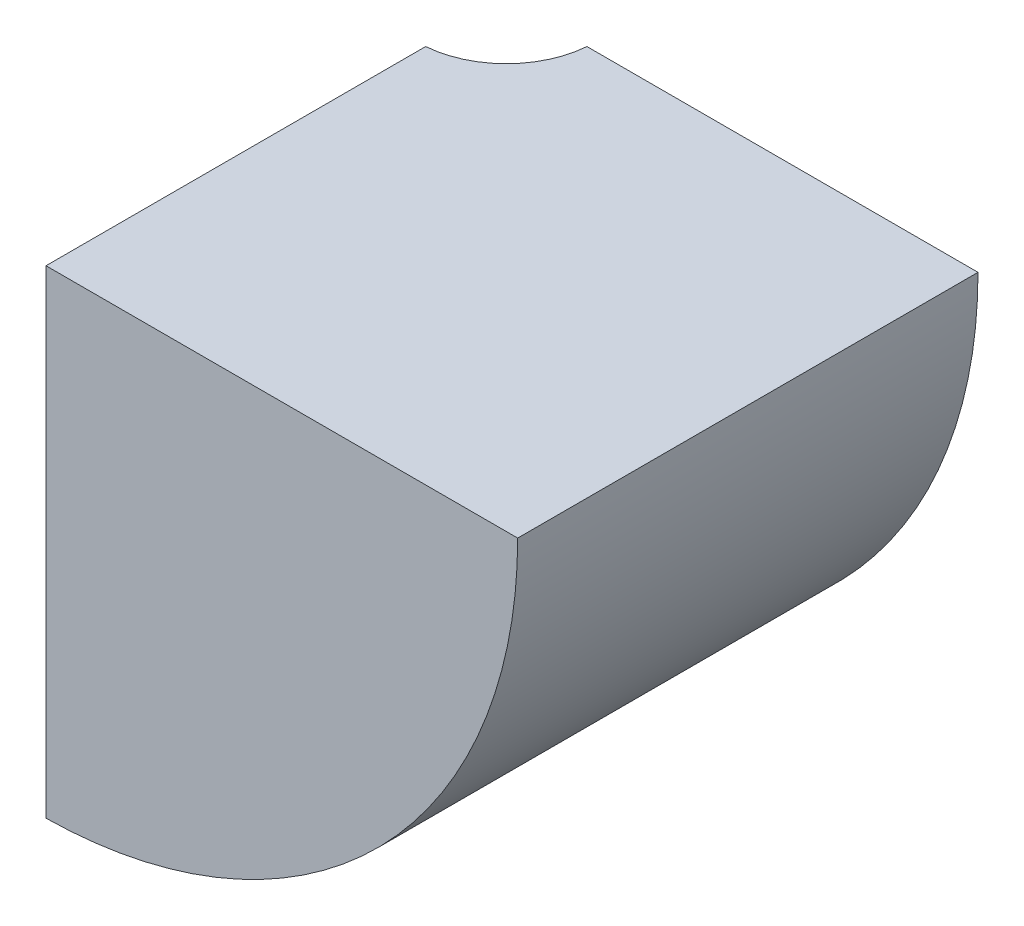
ISO-10303-21;
HEADER;
FILE_DESCRIPTION(('STEP AP214'),'2;1');
FILE_NAME('part.step','',(''),(''),'','','');
FILE_SCHEMA(('AUTOMOTIVE_DESIGN { 1 0 10303 214 1 1 1 1 }'));
ENDSEC;
DATA;
#1=APPLICATION_CONTEXT('core data for automotive mechanical design processes');
#2=APPLICATION_PROTOCOL_DEFINITION('international standard','automotive_design',2000,#1);
#3=PRODUCT_CONTEXT('',#1,'mechanical');
#4=PRODUCT('Part','Part','',(#3));
#5=PRODUCT_RELATED_PRODUCT_CATEGORY('part','',(#4));
#6=PRODUCT_DEFINITION_FORMATION('','',#4);
#7=PRODUCT_DEFINITION_CONTEXT('part definition',#1,'design');
#8=PRODUCT_DEFINITION('design','',#6,#7);
#9=PRODUCT_DEFINITION_SHAPE('','',#8);
#10=(LENGTH_UNIT() NAMED_UNIT(*) SI_UNIT(.MILLI.,.METRE.));
#11=(NAMED_UNIT(*) PLANE_ANGLE_UNIT() SI_UNIT($,.RADIAN.));
#12=(NAMED_UNIT(*) SI_UNIT($,.STERADIAN.) SOLID_ANGLE_UNIT());
#13=UNCERTAINTY_MEASURE_WITH_UNIT(LENGTH_MEASURE(1.E-05),#10,'distance_accuracy_value','');
#14=(GEOMETRIC_REPRESENTATION_CONTEXT(3) GLOBAL_UNCERTAINTY_ASSIGNED_CONTEXT((#13)) GLOBAL_UNIT_ASSIGNED_CONTEXT((#10,
#11,#12)) REPRESENTATION_CONTEXT('',''));
#15=CARTESIAN_POINT('',(0.,0.,0.));
#16=DIRECTION('',(0.,0.,1.));
#17=DIRECTION('',(1.,0.,0.));
#18=AXIS2_PLACEMENT_3D('',#15,#16,#17);
#19=CARTESIAN_POINT('',(0.,0.,41.));
#20=DIRECTION('',(0.,0.,-1.));
#21=DIRECTION('',(-1.,0.,0.));
#22=AXIS2_PLACEMENT_3D('',#19,#20,#21);
#23=CYLINDRICAL_SURFACE('',#22,42.);
#24=CARTESIAN_POINT('',(0.,0.,41.));
#25=DIRECTION('',(0.,0.,1.));
#26=DIRECTION('',(1.,0.,0.));
#27=AXIS2_PLACEMENT_3D('',#24,#25,#26);
#28=CIRCLE('',#27,42.);
#29=CARTESIAN_POINT('',(0.6,-41.9957140670331,41.));
#30=VERTEX_POINT('',#29);
#31=CARTESIAN_POINT('',(42.,0.,41.));
#32=VERTEX_POINT('',#31);
#33=EDGE_CURVE('E100',#30,#32,#28,.T.);
#34=ORIENTED_EDGE('',*,*,#33,.F.);
#35=DIRECTION('',(0.,0.,-1.));
#36=VECTOR('',#35,1.);
#37=CARTESIAN_POINT('',(0.6,-41.9957140670331,41.));
#38=LINE('',#37,#36);
#39=CARTESIAN_POINT('',(0.6,-41.9957140670331,7.6765877836445));
#40=VERTEX_POINT('',#39);
#41=EDGE_CURVE('E81',#30,#40,#38,.T.);
#42=ORIENTED_EDGE('',*,*,#41,.T.);
#43=CARTESIAN_POINT('',(0.,-42.,7.69999999999999));
#44=CARTESIAN_POINT('',(0.214661189812966,-42.0000163933078,7.70002522535463));
#45=CARTESIAN_POINT('',(0.429316458936862,-41.9983548762452,7.69102458371643));
#46=CARTESIAN_POINT('',(0.857056773200532,-41.9917948080387,7.65515552505157));
#47=CARTESIAN_POINT('',(1.07014198500119,-41.9868966056226,7.62828903292973));
#48=CARTESIAN_POINT('',(1.49292882316759,-41.9739911209351,7.55692311719224));
#49=CARTESIAN_POINT('',(1.70263484419704,-41.965988285519,7.5124489117479));
#50=CARTESIAN_POINT('',(2.1174887043463,-41.9471016115582,7.40621912778807));
#51=CARTESIAN_POINT('',(2.32263654143767,-41.9362177717316,7.34446354158237));
#52=CARTESIAN_POINT('',(2.72693909328696,-41.9118697789648,7.2041372814937));
#53=CARTESIAN_POINT('',(2.92609379229552,-41.8984056192444,7.12556656342662));
#54=CARTESIAN_POINT('',(3.31710988226874,-41.8692636087246,6.95216080587093));
#55=CARTESIAN_POINT('',(3.5089685532466,-41.853584942421,6.85731977197585));
#56=CARTESIAN_POINT('',(3.8839850808559,-41.820450675344,6.65209311551742));
#57=CARTESIAN_POINT('',(4.06714417652964,-41.802995328735,6.54170971551683));
#58=CARTESIAN_POINT('',(4.42356806732711,-41.7667827348401,6.30616192114487));
#59=CARTESIAN_POINT('',(4.59683252801584,-41.7480254435964,6.18099702760266));
#60=CARTESIAN_POINT('',(4.93400694104062,-41.709527252614,5.91541168212752));
#61=CARTESIAN_POINT('',(5.09780448389459,-41.6897783199113,5.77484966551783));
#62=CARTESIAN_POINT('',(5.41301119696934,-41.6500246179644,5.48049367544318));
#63=CARTESIAN_POINT('',(5.56442028794676,-41.6300198470847,5.32669961735172));
#64=CARTESIAN_POINT('',(5.85384815061183,-41.5903090754971,5.00689345896104));
#65=CARTESIAN_POINT('',(5.99186410635733,-41.5706031383515,4.84087880209617));
#66=CARTESIAN_POINT('',(6.25351302726115,-41.5320486777089,4.49779020667886));
#67=CARTESIAN_POINT('',(6.3771463316427,-41.5132001339963,4.32071652911134));
#68=CARTESIAN_POINT('',(6.61009361533324,-41.476748652319,3.95524876227588));
#69=CARTESIAN_POINT('',(6.71928498997473,-41.4591568985644,3.76677537082252));
#70=CARTESIAN_POINT('',(6.92133519733714,-41.4259049697142,3.38119503404902));
#71=CARTESIAN_POINT('',(7.0142000108884,-41.4102440879221,3.18409128343498));
#72=CARTESIAN_POINT('',(7.18291728741062,-41.3813126096725,2.78263817543174));
#73=CARTESIAN_POINT('',(7.25877609459446,-41.3680411221993,2.57829155310602));
#74=CARTESIAN_POINT('',(7.39291955762718,-41.3442784833262,2.16384029875247));
#75=CARTESIAN_POINT('',(7.45120850697619,-41.3337866527449,1.95373708715971));
#76=CARTESIAN_POINT('',(7.56669579487874,-41.3128279305321,1.45626018583863));
#77=CARTESIAN_POINT('',(7.61666221576772,-41.3036039817758,1.16710148292995));
#78=CARTESIAN_POINT('',(7.66664585316107,-41.2943431982756,0.730756565595945));
#79=CARTESIAN_POINT('',(7.67914605345211,-41.2920188085843,0.584928207318106));
#80=CARTESIAN_POINT('',(7.6958234407679,-41.2889130888019,0.292746587087686));
#81=CARTESIAN_POINT('',(7.69999872929735,-41.288132110686,0.146393213026887));
#82=CARTESIAN_POINT('',(7.7,-41.2881338885642,0.));
#83=B_SPLINE_CURVE_WITH_KNOTS('',3,(#43,#44,#45,#46,#47,#48,#49,#50,#51,#52,#53,#54,#55,#56,#57,
#58,#59,#60,#61,#62,#63,#64,#65,#66,#67,#68,#69,#70,#71,#72,#73,#74,#75,#76,#77,#78,#79,#80,#81,
#82),.UNSPECIFIED.,.F.,.F.,(4,2,2,2,2,2,2,2,2,2,2,2,2,2,2,2,2,2,2,4),(0.,0.643779697213744,
1.28749004346622,1.93028176892669,2.57307378042971,3.21586748097861,3.85889851400501,
4.5018376866233,5.14479857750093,5.79426608670598,6.44373774993785,7.09334567177995,
7.74293826913184,8.39773308887107,9.05228753870625,9.70659739443971,10.3607472283209,
11.2392736650466,11.678212268625,12.1172509606643),.UNSPECIFIED.);
#84=CARTESIAN_POINT('',(7.6765877836445,-41.2924932645148,0.600000000000001));
#85=VERTEX_POINT('',#84);
#86=EDGE_CURVE('E104',#40,#85,#83,.T.);
#87=ORIENTED_EDGE('',*,*,#86,.T.);
#88=CARTESIAN_POINT('',(0.,0.,0.599999999999996));
#89=DIRECTION('',(0.,0.,1.));
#90=DIRECTION('',(1.,0.,0.));
#91=AXIS2_PLACEMENT_3D('',#88,#89,#90);
#92=CIRCLE('',#91,42.);
#93=CARTESIAN_POINT('',(42.,0.,0.599999999999998));
#94=VERTEX_POINT('',#93);
#95=EDGE_CURVE('E62',#85,#94,#92,.T.);
#96=ORIENTED_EDGE('',*,*,#95,.T.);
#97=DIRECTION('',(0.,0.,1.));
#98=VECTOR('',#97,1.);
#99=CARTESIAN_POINT('',(42.,0.,0.));
#100=LINE('',#99,#98);
#101=EDGE_CURVE('E103',#94,#32,#100,.T.);
#102=ORIENTED_EDGE('',*,*,#101,.T.);
#103=EDGE_LOOP('',(#34,#42,#87,#96,#102));
#104=FACE_BOUND('',#103,.T.);
#105=ADVANCED_FACE('F39',(#104),#23,.T.);
#106=CARTESIAN_POINT('',(0.,0.,41.));
#107=DIRECTION('',(0.,0.,1.));
#108=DIRECTION('',(1.,0.,0.));
#109=AXIS2_PLACEMENT_3D('',#106,#107,#108);
#110=PLANE('',#109);
#111=DIRECTION('',(0.,1.,0.));
#112=VECTOR('',#111,1.);
#113=CARTESIAN_POINT('',(0.6,-42.,41.));
#114=LINE('',#113,#112);
#115=CARTESIAN_POINT('',(0.6,0.,41.));
#116=VERTEX_POINT('',#115);
#117=EDGE_CURVE('E78',#30,#116,#114,.T.);
#118=ORIENTED_EDGE('',*,*,#117,.F.);
#119=ORIENTED_EDGE('',*,*,#33,.T.);
#120=DIRECTION('',(1.,0.,0.));
#121=VECTOR('',#120,1.);
#122=CARTESIAN_POINT('',(0.,0.,41.));
#123=LINE('',#122,#121);
#124=EDGE_CURVE('E92',#116,#32,#123,.T.);
#125=ORIENTED_EDGE('',*,*,#124,.F.);
#126=EDGE_LOOP('',(#118,#119,#125));
#127=FACE_BOUND('',#126,.T.);
#128=ADVANCED_FACE('F99',(#127),#110,.T.);
#129=CARTESIAN_POINT('',(0.,0.,0.));
#130=DIRECTION('',(0.,-1.,0.));
#131=DIRECTION('',(0.,0.,-1.));
#132=AXIS2_PLACEMENT_3D('',#129,#130,#131);
#133=PLANE('',#132);
#134=CARTESIAN_POINT('',(0.,0.,0.));
#135=DIRECTION('',(0.,1.,0.));
#136=DIRECTION('',(0.,0.,1.));
#137=AXIS2_PLACEMENT_3D('',#134,#135,#136);
#138=CIRCLE('',#137,7.7);
#139=CARTESIAN_POINT('',(0.6,0.,7.6765877836445));
#140=VERTEX_POINT('',#139);
#141=CARTESIAN_POINT('',(7.6765877836445,0.,0.600000000000001));
#142=VERTEX_POINT('',#141);
#143=EDGE_CURVE('E95',#140,#142,#138,.T.);
#144=ORIENTED_EDGE('',*,*,#143,.F.);
#145=DIRECTION('',(0.,0.,-1.));
#146=VECTOR('',#145,1.);
#147=CARTESIAN_POINT('',(0.6,0.,41.));
#148=LINE('',#147,#146);
#149=EDGE_CURVE('E55',#116,#140,#148,.T.);
#150=ORIENTED_EDGE('',*,*,#149,.F.);
#151=ORIENTED_EDGE('',*,*,#124,.T.);
#152=ORIENTED_EDGE('',*,*,#101,.F.);
#153=DIRECTION('',(1.,0.,0.));
#154=VECTOR('',#153,1.);
#155=CARTESIAN_POINT('',(42.,0.,0.599999999999998));
#156=LINE('',#155,#154);
#157=EDGE_CURVE('E97',#142,#94,#156,.T.);
#158=ORIENTED_EDGE('',*,*,#157,.F.);
#159=EDGE_LOOP('',(#144,#150,#151,#152,#158));
#160=FACE_BOUND('',#159,.T.);
#161=ADVANCED_FACE('F90',(#160),#133,.F.);
#162=CARTESIAN_POINT('',(0.,-42.,0.));
#163=DIRECTION('',(0.,1.,0.));
#164=DIRECTION('',(0.,0.,1.));
#165=AXIS2_PLACEMENT_3D('',#162,#163,#164);
#166=CYLINDRICAL_SURFACE('',#165,7.7);
#167=ORIENTED_EDGE('',*,*,#86,.F.);
#168=DIRECTION('',(0.,1.,0.));
#169=VECTOR('',#168,1.);
#170=CARTESIAN_POINT('',(0.6,-42.,7.6765877836445));
#171=LINE('',#170,#169);
#172=EDGE_CURVE('E11',#40,#140,#171,.T.);
#173=ORIENTED_EDGE('',*,*,#172,.T.);
#174=ORIENTED_EDGE('',*,*,#143,.T.);
#175=DIRECTION('',(0.,1.,0.));
#176=VECTOR('',#175,1.);
#177=CARTESIAN_POINT('',(7.6765877836445,-42.,0.600000000000001));
#178=LINE('',#177,#176);
#179=EDGE_CURVE('E48',#142,#85,#178,.F.);
#180=ORIENTED_EDGE('',*,*,#179,.T.);
#181=EDGE_LOOP('',(#167,#173,#174,#180));
#182=FACE_BOUND('',#181,.T.);
#183=ADVANCED_FACE('F122',(#182),#166,.F.);
#184=CARTESIAN_POINT('',(42.,-42.,0.599999999999998));
#185=DIRECTION('',(0.,0.,1.));
#186=DIRECTION('',(1.,0.,0.));
#187=AXIS2_PLACEMENT_3D('',#184,#185,#186);
#188=PLANE('',#187);
#189=ORIENTED_EDGE('',*,*,#179,.F.);
#190=ORIENTED_EDGE('',*,*,#157,.T.);
#191=ORIENTED_EDGE('',*,*,#95,.F.);
#192=EDGE_LOOP('',(#189,#190,#191));
#193=FACE_BOUND('',#192,.T.);
#194=ADVANCED_FACE('F131',(#193),#188,.F.);
#195=CARTESIAN_POINT('',(0.6,-42.,41.));
#196=DIRECTION('',(1.,0.,0.));
#197=DIRECTION('',(0.,0.,-1.));
#198=AXIS2_PLACEMENT_3D('',#195,#196,#197);
#199=PLANE('',#198);
#200=ORIENTED_EDGE('',*,*,#117,.T.);
#201=ORIENTED_EDGE('',*,*,#149,.T.);
#202=ORIENTED_EDGE('',*,*,#172,.F.);
#203=ORIENTED_EDGE('',*,*,#41,.F.);
#204=EDGE_LOOP('',(#200,#201,#202,#203));
#205=FACE_BOUND('',#204,.T.);
#206=ADVANCED_FACE('F79',(#205),#199,.F.);
#207=CLOSED_SHELL('',(#105,#128,#161,#183,#194,#206));
#208=MANIFOLD_SOLID_BREP('B2',#207);
#209=ADVANCED_BREP_SHAPE_REPRESENTATION('',(#18,#208),#14);
#210=SHAPE_DEFINITION_REPRESENTATION(#9,#209);
ENDSEC;
END-ISO-10303-21;
